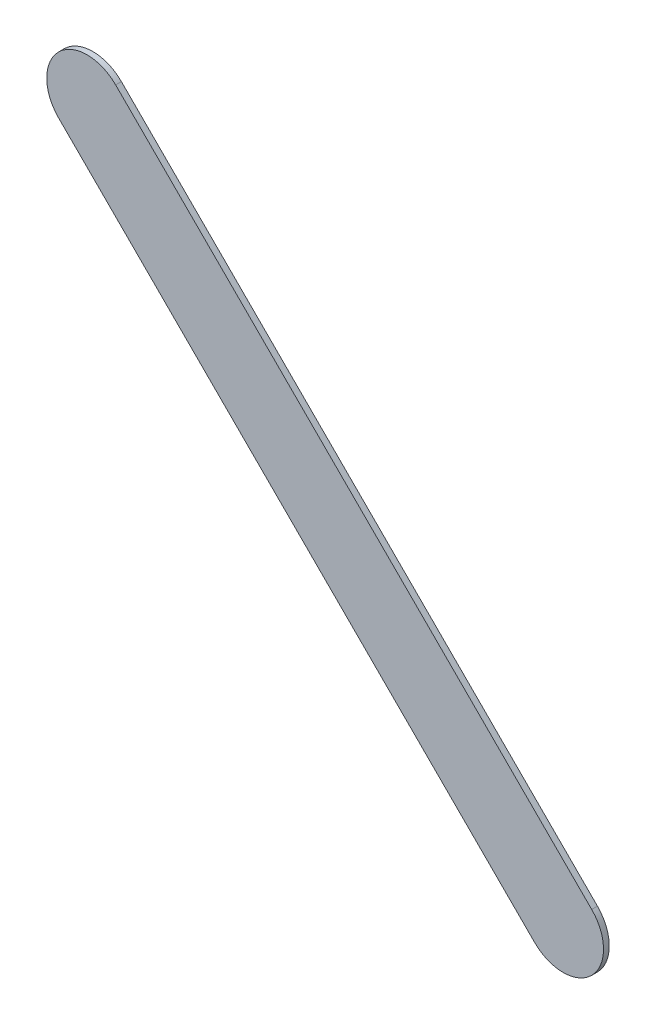
ISO-10303-21;
HEADER;
FILE_DESCRIPTION(('STEP AP214'),'2;1');
FILE_NAME('part.step','',(''),(''),'','','');
FILE_SCHEMA(('AUTOMOTIVE_DESIGN { 1 0 10303 214 1 1 1 1 }'));
ENDSEC;
DATA;
#1=APPLICATION_CONTEXT('core data for automotive mechanical design processes');
#2=APPLICATION_PROTOCOL_DEFINITION('international standard','automotive_design',2000,#1);
#3=PRODUCT_CONTEXT('',#1,'mechanical');
#4=PRODUCT('Part','Part','',(#3));
#5=PRODUCT_RELATED_PRODUCT_CATEGORY('part','',(#4));
#6=PRODUCT_DEFINITION_FORMATION('','',#4);
#7=PRODUCT_DEFINITION_CONTEXT('part definition',#1,'design');
#8=PRODUCT_DEFINITION('design','',#6,#7);
#9=PRODUCT_DEFINITION_SHAPE('','',#8);
#10=(LENGTH_UNIT() NAMED_UNIT(*) SI_UNIT(.MILLI.,.METRE.));
#11=(NAMED_UNIT(*) PLANE_ANGLE_UNIT() SI_UNIT($,.RADIAN.));
#12=(NAMED_UNIT(*) SI_UNIT($,.STERADIAN.) SOLID_ANGLE_UNIT());
#13=UNCERTAINTY_MEASURE_WITH_UNIT(LENGTH_MEASURE(1.E-05),#10,'distance_accuracy_value','');
#14=(GEOMETRIC_REPRESENTATION_CONTEXT(3) GLOBAL_UNCERTAINTY_ASSIGNED_CONTEXT((#13)) GLOBAL_UNIT_ASSIGNED_CONTEXT((#10,
#11,#12)) REPRESENTATION_CONTEXT('',''));
#15=CARTESIAN_POINT('',(0.,0.,0.));
#16=DIRECTION('',(0.,0.,1.));
#17=DIRECTION('',(1.,0.,0.));
#18=AXIS2_PLACEMENT_3D('',#15,#16,#17);
#19=CARTESIAN_POINT('',(55.7752123,111.77123442,0.));
#20=DIRECTION('',(0.707106781186548,0.707106781186548,0.));
#21=DIRECTION('',(0.707106781186548,-0.707106781186548,0.));
#22=AXIS2_PLACEMENT_3D('',#19,#20,#21);
#23=PLANE('',#22);
#24=DIRECTION('',(0.707106781186548,-0.707106781186548,0.));
#25=VECTOR('',#24,1.);
#26=CARTESIAN_POINT('',(55.7752123,111.77123442,0.03556));
#27=LINE('',#26,#25);
#28=CARTESIAN_POINT('',(55.7752123,111.77123442,0.03556));
#29=VERTEX_POINT('',#28);
#30=CARTESIAN_POINT('',(58.72323282,108.8232139,0.03556));
#31=VERTEX_POINT('',#30);
#32=EDGE_CURVE('E11',#29,#31,#27,.T.);
#33=ORIENTED_EDGE('',*,*,#32,.F.);
#34=DIRECTION('',(0.,0.,1.));
#35=VECTOR('',#34,1.);
#36=CARTESIAN_POINT('',(55.7752123,111.77123442,0.));
#37=LINE('',#36,#35);
#38=CARTESIAN_POINT('',(55.7752123,111.77123442,0.));
#39=VERTEX_POINT('',#38);
#40=EDGE_CURVE('E24',#39,#29,#37,.T.);
#41=ORIENTED_EDGE('',*,*,#40,.F.);
#42=DIRECTION('',(0.707106781186548,-0.707106781186548,0.));
#43=VECTOR('',#42,1.);
#44=CARTESIAN_POINT('',(55.7752123,111.77123442,0.));
#45=LINE('',#44,#43);
#46=CARTESIAN_POINT('',(58.72323282,108.8232139,0.));
#47=VERTEX_POINT('',#46);
#48=EDGE_CURVE('E75',#39,#47,#45,.T.);
#49=ORIENTED_EDGE('',*,*,#48,.T.);
#50=DIRECTION('',(0.,0.,1.));
#51=VECTOR('',#50,1.);
#52=CARTESIAN_POINT('',(58.72323282,108.8232139,0.));
#53=LINE('',#52,#51);
#54=EDGE_CURVE('E37',#47,#31,#53,.T.);
#55=ORIENTED_EDGE('',*,*,#54,.T.);
#56=EDGE_LOOP('',(#33,#41,#49,#55));
#57=FACE_BOUND('',#56,.T.);
#58=ADVANCED_FACE('F17',(#57),#23,.F.);
#59=CARTESIAN_POINT('',(58.9000092,108.99999028,0.));
#60=DIRECTION('',(0.,0.,-1.));
#61=DIRECTION('',(-0.707106781186562,-0.707106781186533,0.));
#62=AXIS2_PLACEMENT_3D('',#59,#60,#61);
#63=CYLINDRICAL_SURFACE('',#62,0.249999554103215);
#64=CARTESIAN_POINT('',(58.9000092,108.99999028,0.03556));
#65=DIRECTION('',(0.,0.,1.));
#66=DIRECTION('',(-0.707106781186562,-0.707106781186533,0.));
#67=AXIS2_PLACEMENT_3D('',#64,#65,#66);
#68=CIRCLE('',#67,0.249999554103215);
#69=CARTESIAN_POINT('',(59.07678558,109.17676666,0.03556));
#70=VERTEX_POINT('',#69);
#71=EDGE_CURVE('E83',#31,#70,#68,.T.);
#72=ORIENTED_EDGE('',*,*,#71,.F.);
#73=ORIENTED_EDGE('',*,*,#54,.F.);
#74=CARTESIAN_POINT('',(58.9000092,108.99999028,0.));
#75=DIRECTION('',(0.,0.,1.));
#76=DIRECTION('',(-0.707106781186562,-0.707106781186533,0.));
#77=AXIS2_PLACEMENT_3D('',#74,#75,#76);
#78=CIRCLE('',#77,0.249999554103215);
#79=CARTESIAN_POINT('',(59.07678558,109.17676666,0.));
#80=VERTEX_POINT('',#79);
#81=EDGE_CURVE('E81',#47,#80,#78,.T.);
#82=ORIENTED_EDGE('',*,*,#81,.T.);
#83=DIRECTION('',(0.,0.,1.));
#84=VECTOR('',#83,1.);
#85=CARTESIAN_POINT('',(59.07678558,109.17676666,0.));
#86=LINE('',#85,#84);
#87=EDGE_CURVE('E67',#80,#70,#86,.T.);
#88=ORIENTED_EDGE('',*,*,#87,.T.);
#89=EDGE_LOOP('',(#72,#73,#82,#88));
#90=FACE_BOUND('',#89,.T.);
#91=ADVANCED_FACE('F89',(#90),#63,.T.);
#92=CARTESIAN_POINT('',(59.07678558,109.17676666,0.));
#93=DIRECTION('',(-0.707106781186547,-0.707106781186548,0.));
#94=DIRECTION('',(-0.707106781186548,0.707106781186547,0.));
#95=AXIS2_PLACEMENT_3D('',#92,#93,#94);
#96=PLANE('',#95);
#97=DIRECTION('',(-0.707106781186548,0.707106781186547,0.));
#98=VECTOR('',#97,1.);
#99=CARTESIAN_POINT('',(59.07678558,109.17676666,0.03556));
#100=LINE('',#99,#98);
#101=CARTESIAN_POINT('',(56.12876506,112.12478718,0.03556));
#102=VERTEX_POINT('',#101);
#103=EDGE_CURVE('E71',#70,#102,#100,.T.);
#104=ORIENTED_EDGE('',*,*,#103,.F.);
#105=ORIENTED_EDGE('',*,*,#87,.F.);
#106=DIRECTION('',(-0.707106781186548,0.707106781186547,0.));
#107=VECTOR('',#106,1.);
#108=CARTESIAN_POINT('',(59.07678558,109.17676666,0.));
#109=LINE('',#108,#107);
#110=CARTESIAN_POINT('',(56.12876506,112.12478718,0.));
#111=VERTEX_POINT('',#110);
#112=EDGE_CURVE('E63',#80,#111,#109,.T.);
#113=ORIENTED_EDGE('',*,*,#112,.T.);
#114=DIRECTION('',(0.,0.,1.));
#115=VECTOR('',#114,1.);
#116=CARTESIAN_POINT('',(56.12876506,112.12478718,0.));
#117=LINE('',#116,#115);
#118=EDGE_CURVE('E53',#111,#102,#117,.T.);
#119=ORIENTED_EDGE('',*,*,#118,.T.);
#120=EDGE_LOOP('',(#104,#105,#113,#119));
#121=FACE_BOUND('',#120,.T.);
#122=ADVANCED_FACE('F66',(#121),#96,.F.);
#123=CARTESIAN_POINT('',(55.95198868,111.9480108,0.));
#124=DIRECTION('',(0.,0.,-1.));
#125=DIRECTION('',(0.707106781186548,0.707106781186548,0.));
#126=AXIS2_PLACEMENT_3D('',#123,#124,#125);
#127=CYLINDRICAL_SURFACE('',#126,0.249999554103213);
#128=CARTESIAN_POINT('',(55.95198868,111.9480108,0.03556));
#129=DIRECTION('',(0.,0.,1.));
#130=DIRECTION('',(0.707106781186548,0.707106781186548,0.));
#131=AXIS2_PLACEMENT_3D('',#128,#129,#130);
#132=CIRCLE('',#131,0.249999554103213);
#133=EDGE_CURVE('E59',#102,#29,#132,.T.);
#134=ORIENTED_EDGE('',*,*,#133,.F.);
#135=ORIENTED_EDGE('',*,*,#118,.F.);
#136=CARTESIAN_POINT('',(55.95198868,111.9480108,0.));
#137=DIRECTION('',(0.,0.,1.));
#138=DIRECTION('',(0.707106781186548,0.707106781186548,0.));
#139=AXIS2_PLACEMENT_3D('',#136,#137,#138);
#140=CIRCLE('',#139,0.249999554103213);
#141=EDGE_CURVE('E57',#111,#39,#140,.T.);
#142=ORIENTED_EDGE('',*,*,#141,.T.);
#143=ORIENTED_EDGE('',*,*,#40,.T.);
#144=EDGE_LOOP('',(#134,#135,#142,#143));
#145=FACE_BOUND('',#144,.T.);
#146=ADVANCED_FACE('F55',(#145),#127,.T.);
#147=CARTESIAN_POINT('',(55.7752123,111.77123442,0.));
#148=DIRECTION('',(0.,0.,-1.));
#149=DIRECTION('',(-1.,0.,0.));
#150=AXIS2_PLACEMENT_3D('',#147,#148,#149);
#151=PLANE('',#150);
#152=ORIENTED_EDGE('',*,*,#141,.F.);
#153=ORIENTED_EDGE('',*,*,#112,.F.);
#154=ORIENTED_EDGE('',*,*,#81,.F.);
#155=ORIENTED_EDGE('',*,*,#48,.F.);
#156=EDGE_LOOP('',(#152,#153,#154,#155));
#157=FACE_BOUND('',#156,.T.);
#158=ADVANCED_FACE('F74',(#157),#151,.T.);
#159=CARTESIAN_POINT('',(55.7752123,111.77123442,0.03556));
#160=DIRECTION('',(0.,0.,-1.));
#161=DIRECTION('',(-1.,0.,0.));
#162=AXIS2_PLACEMENT_3D('',#159,#160,#161);
#163=PLANE('',#162);
#164=ORIENTED_EDGE('',*,*,#32,.T.);
#165=ORIENTED_EDGE('',*,*,#71,.T.);
#166=ORIENTED_EDGE('',*,*,#103,.T.);
#167=ORIENTED_EDGE('',*,*,#133,.T.);
#168=EDGE_LOOP('',(#164,#165,#166,#167));
#169=FACE_BOUND('',#168,.T.);
#170=ADVANCED_FACE('F91',(#169),#163,.F.);
#171=CLOSED_SHELL('',(#58,#91,#122,#146,#158,#170));
#172=MANIFOLD_SOLID_BREP('B1',#171);
#173=ADVANCED_BREP_SHAPE_REPRESENTATION('',(#18,#172),#14);
#174=SHAPE_DEFINITION_REPRESENTATION(#9,#173);
ENDSEC;
END-ISO-10303-21;
